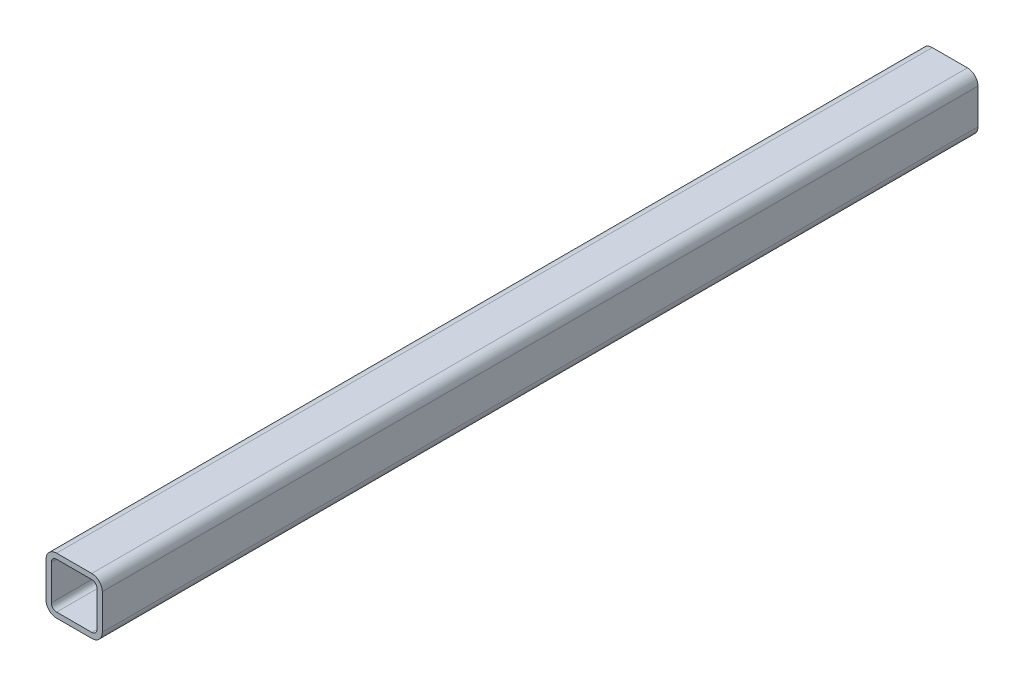
ISO-10303-21;
HEADER;
FILE_DESCRIPTION(('STEP AP214'),'2;1');
FILE_NAME('part.step','',(''),(''),'','','');
FILE_SCHEMA(('AUTOMOTIVE_DESIGN { 1 0 10303 214 1 1 1 1 }'));
ENDSEC;
DATA;
#1=APPLICATION_CONTEXT('core data for automotive mechanical design processes');
#2=APPLICATION_PROTOCOL_DEFINITION('international standard','automotive_design',2000,#1);
#3=PRODUCT_CONTEXT('',#1,'mechanical');
#4=PRODUCT('Part','Part','',(#3));
#5=PRODUCT_RELATED_PRODUCT_CATEGORY('part','',(#4));
#6=PRODUCT_DEFINITION_FORMATION('','',#4);
#7=PRODUCT_DEFINITION_CONTEXT('part definition',#1,'design');
#8=PRODUCT_DEFINITION('design','',#6,#7);
#9=PRODUCT_DEFINITION_SHAPE('','',#8);
#10=(LENGTH_UNIT() NAMED_UNIT(*) SI_UNIT(.MILLI.,.METRE.));
#11=(NAMED_UNIT(*) PLANE_ANGLE_UNIT() SI_UNIT($,.RADIAN.));
#12=(NAMED_UNIT(*) SI_UNIT($,.STERADIAN.) SOLID_ANGLE_UNIT());
#13=UNCERTAINTY_MEASURE_WITH_UNIT(LENGTH_MEASURE(1.E-05),#10,'distance_accuracy_value','');
#14=(GEOMETRIC_REPRESENTATION_CONTEXT(3) GLOBAL_UNCERTAINTY_ASSIGNED_CONTEXT((#13)) GLOBAL_UNIT_ASSIGNED_CONTEXT((#10,
#11,#12)) REPRESENTATION_CONTEXT('',''));
#15=CARTESIAN_POINT('',(0.,0.,0.));
#16=DIRECTION('',(0.,0.,1.));
#17=DIRECTION('',(1.,0.,0.));
#18=AXIS2_PLACEMENT_3D('',#15,#16,#17);
#19=CARTESIAN_POINT('',(41.27,41.27,790.2));
#20=DIRECTION('',(0.,0.,-1.));
#21=DIRECTION('',(-1.,0.,0.));
#22=AXIS2_PLACEMENT_3D('',#19,#20,#21);
#23=PLANE('',#22);
#24=CARTESIAN_POINT('',(41.27,41.27,790.2));
#25=DIRECTION('',(0.,0.,1.));
#26=DIRECTION('',(-1.,0.,0.));
#27=AXIS2_PLACEMENT_3D('',#24,#25,#26);
#28=CIRCLE('',#27,9.53);
#29=CARTESIAN_POINT('',(50.8,41.2699999999999,790.2));
#30=VERTEX_POINT('',#29);
#31=CARTESIAN_POINT('',(41.2699999999999,50.8,790.2));
#32=VERTEX_POINT('',#31);
#33=EDGE_CURVE('E246',#30,#32,#28,.T.);
#34=ORIENTED_EDGE('',*,*,#33,.T.);
#35=DIRECTION('',(-1.,0.,0.));
#36=VECTOR('',#35,1.);
#37=CARTESIAN_POINT('',(9.53000000000007,50.8,790.2));
#38=LINE('',#37,#36);
#39=CARTESIAN_POINT('',(9.53000000000007,50.8,790.2));
#40=VERTEX_POINT('',#39);
#41=EDGE_CURVE('E250',#32,#40,#38,.T.);
#42=ORIENTED_EDGE('',*,*,#41,.T.);
#43=CARTESIAN_POINT('',(9.53,41.27,790.2));
#44=DIRECTION('',(0.,0.,1.));
#45=DIRECTION('',(-1.,0.,0.));
#46=AXIS2_PLACEMENT_3D('',#43,#44,#45);
#47=CIRCLE('',#46,9.53);
#48=CARTESIAN_POINT('',(0.,41.2699999999999,790.2));
#49=VERTEX_POINT('',#48);
#50=EDGE_CURVE('E254',#40,#49,#47,.T.);
#51=ORIENTED_EDGE('',*,*,#50,.T.);
#52=DIRECTION('',(0.,-1.,0.));
#53=VECTOR('',#52,1.);
#54=CARTESIAN_POINT('',(0.,9.53000000000007,790.2));
#55=LINE('',#54,#53);
#56=CARTESIAN_POINT('',(0.,9.53000000000007,790.2));
#57=VERTEX_POINT('',#56);
#58=EDGE_CURVE('E257',#49,#57,#55,.T.);
#59=ORIENTED_EDGE('',*,*,#58,.T.);
#60=CARTESIAN_POINT('',(9.53,9.53,790.2));
#61=DIRECTION('',(0.,0.,1.));
#62=DIRECTION('',(-1.,0.,0.));
#63=AXIS2_PLACEMENT_3D('',#60,#61,#62);
#64=CIRCLE('',#63,9.53);
#65=CARTESIAN_POINT('',(9.53000000000007,0.,790.2));
#66=VERTEX_POINT('',#65);
#67=EDGE_CURVE('E260',#57,#66,#64,.T.);
#68=ORIENTED_EDGE('',*,*,#67,.T.);
#69=DIRECTION('',(1.,0.,0.));
#70=VECTOR('',#69,1.);
#71=CARTESIAN_POINT('',(9.53000000000007,0.,790.2));
#72=LINE('',#71,#70);
#73=CARTESIAN_POINT('',(41.2699999999999,0.,790.2));
#74=VERTEX_POINT('',#73);
#75=EDGE_CURVE('E263',#66,#74,#72,.T.);
#76=ORIENTED_EDGE('',*,*,#75,.T.);
#77=CARTESIAN_POINT('',(41.27,9.53,790.2));
#78=DIRECTION('',(0.,0.,1.));
#79=DIRECTION('',(-1.,0.,0.));
#80=AXIS2_PLACEMENT_3D('',#77,#78,#79);
#81=CIRCLE('',#80,9.53);
#82=CARTESIAN_POINT('',(50.8,9.53000000000007,790.2));
#83=VERTEX_POINT('',#82);
#84=EDGE_CURVE('E266',#74,#83,#81,.T.);
#85=ORIENTED_EDGE('',*,*,#84,.T.);
#86=DIRECTION('',(0.,1.,0.));
#87=VECTOR('',#86,1.);
#88=CARTESIAN_POINT('',(50.8,9.53000000000007,790.2));
#89=LINE('',#88,#87);
#90=EDGE_CURVE('E269',#83,#30,#89,.T.);
#91=ORIENTED_EDGE('',*,*,#90,.T.);
#92=EDGE_LOOP('',(#34,#42,#51,#59,#68,#76,#85,#91));
#93=FACE_BOUND('',#92,.T.);
#94=CARTESIAN_POINT('',(9.52,9.52,790.2));
#95=DIRECTION('',(0.,0.,1.));
#96=DIRECTION('',(1.,0.,0.));
#97=AXIS2_PLACEMENT_3D('',#94,#95,#96);
#98=CIRCLE('',#97,4.76);
#99=CARTESIAN_POINT('',(4.76,9.52000000000003,790.2));
#100=VERTEX_POINT('',#99);
#101=CARTESIAN_POINT('',(9.52000000000004,4.76,790.2));
#102=VERTEX_POINT('',#101);
#103=EDGE_CURVE('E157',#100,#102,#98,.T.);
#104=ORIENTED_EDGE('',*,*,#103,.F.);
#105=DIRECTION('',(0.,-1.,0.));
#106=VECTOR('',#105,1.);
#107=CARTESIAN_POINT('',(4.76,41.28,790.2));
#108=LINE('',#107,#106);
#109=CARTESIAN_POINT('',(4.76,41.28,790.2));
#110=VERTEX_POINT('',#109);
#111=EDGE_CURVE('E198',#110,#100,#108,.T.);
#112=ORIENTED_EDGE('',*,*,#111,.F.);
#113=CARTESIAN_POINT('',(9.52,41.28,790.2));
#114=DIRECTION('',(0.,0.,1.));
#115=DIRECTION('',(-1.,0.,0.));
#116=AXIS2_PLACEMENT_3D('',#113,#114,#115);
#117=CIRCLE('',#116,4.76);
#118=CARTESIAN_POINT('',(9.52000000000003,46.04,790.2));
#119=VERTEX_POINT('',#118);
#120=EDGE_CURVE('E195',#119,#110,#117,.T.);
#121=ORIENTED_EDGE('',*,*,#120,.F.);
#122=DIRECTION('',(-1.,0.,0.));
#123=VECTOR('',#122,1.);
#124=CARTESIAN_POINT('',(9.52000000000003,46.04,790.2));
#125=LINE('',#124,#123);
#126=CARTESIAN_POINT('',(41.28,46.04,790.2));
#127=VERTEX_POINT('',#126);
#128=EDGE_CURVE('E192',#127,#119,#125,.T.);
#129=ORIENTED_EDGE('',*,*,#128,.F.);
#130=CARTESIAN_POINT('',(41.28,41.28,790.2));
#131=DIRECTION('',(0.,0.,1.));
#132=DIRECTION('',(1.,0.,0.));
#133=AXIS2_PLACEMENT_3D('',#130,#131,#132);
#134=CIRCLE('',#133,4.76);
#135=CARTESIAN_POINT('',(46.04,41.28,790.2));
#136=VERTEX_POINT('',#135);
#137=EDGE_CURVE('E189',#136,#127,#134,.T.);
#138=ORIENTED_EDGE('',*,*,#137,.F.);
#139=DIRECTION('',(0.,1.,0.));
#140=VECTOR('',#139,1.);
#141=CARTESIAN_POINT('',(46.04,41.28,790.2));
#142=LINE('',#141,#140);
#143=CARTESIAN_POINT('',(46.04,9.52000000000003,790.2));
#144=VERTEX_POINT('',#143);
#145=EDGE_CURVE('E184',#144,#136,#142,.T.);
#146=ORIENTED_EDGE('',*,*,#145,.F.);
#147=CARTESIAN_POINT('',(41.28,9.52,790.2));
#148=DIRECTION('',(0.,0.,1.));
#149=DIRECTION('',(1.,0.,0.));
#150=AXIS2_PLACEMENT_3D('',#147,#148,#149);
#151=CIRCLE('',#150,4.76);
#152=CARTESIAN_POINT('',(41.28,4.76,790.2));
#153=VERTEX_POINT('',#152);
#154=EDGE_CURVE('E180',#153,#144,#151,.T.);
#155=ORIENTED_EDGE('',*,*,#154,.F.);
#156=DIRECTION('',(1.,0.,0.));
#157=VECTOR('',#156,1.);
#158=CARTESIAN_POINT('',(9.52000000000004,4.76,790.2));
#159=LINE('',#158,#157);
#160=EDGE_CURVE('E166',#102,#153,#159,.T.);
#161=ORIENTED_EDGE('',*,*,#160,.F.);
#162=EDGE_LOOP('',(#104,#112,#121,#129,#138,#146,#155,#161));
#163=FACE_BOUND('',#162,.T.);
#164=ADVANCED_FACE('F43',(#93,#163),#23,.F.);
#165=CARTESIAN_POINT('',(41.27,41.27,0.));
#166=DIRECTION('',(0.,0.,-1.));
#167=DIRECTION('',(-1.,0.,0.));
#168=AXIS2_PLACEMENT_3D('',#165,#166,#167);
#169=PLANE('',#168);
#170=CARTESIAN_POINT('',(41.27,41.27,0.));
#171=DIRECTION('',(0.,0.,1.));
#172=DIRECTION('',(-1.,0.,0.));
#173=AXIS2_PLACEMENT_3D('',#170,#171,#172);
#174=CIRCLE('',#173,9.53);
#175=CARTESIAN_POINT('',(50.8,41.2699999999999,0.));
#176=VERTEX_POINT('',#175);
#177=CARTESIAN_POINT('',(41.2699999999999,50.8,0.));
#178=VERTEX_POINT('',#177);
#179=EDGE_CURVE('E175',#176,#178,#174,.T.);
#180=ORIENTED_EDGE('',*,*,#179,.F.);
#181=DIRECTION('',(0.,1.,0.));
#182=VECTOR('',#181,1.);
#183=CARTESIAN_POINT('',(50.8,9.53000000000007,0.));
#184=LINE('',#183,#182);
#185=CARTESIAN_POINT('',(50.8,9.53000000000007,0.));
#186=VERTEX_POINT('',#185);
#187=EDGE_CURVE('E251',#186,#176,#184,.T.);
#188=ORIENTED_EDGE('',*,*,#187,.F.);
#189=CARTESIAN_POINT('',(41.27,9.53,0.));
#190=DIRECTION('',(0.,0.,1.));
#191=DIRECTION('',(-1.,0.,0.));
#192=AXIS2_PLACEMENT_3D('',#189,#190,#191);
#193=CIRCLE('',#192,9.53);
#194=CARTESIAN_POINT('',(41.2699999999999,0.,0.));
#195=VERTEX_POINT('',#194);
#196=EDGE_CURVE('E291',#195,#186,#193,.T.);
#197=ORIENTED_EDGE('',*,*,#196,.F.);
#198=DIRECTION('',(1.,0.,0.));
#199=VECTOR('',#198,1.);
#200=CARTESIAN_POINT('',(9.53000000000007,0.,0.));
#201=LINE('',#200,#199);
#202=CARTESIAN_POINT('',(9.53000000000007,0.,0.));
#203=VERTEX_POINT('',#202);
#204=EDGE_CURVE('E288',#203,#195,#201,.T.);
#205=ORIENTED_EDGE('',*,*,#204,.F.);
#206=CARTESIAN_POINT('',(9.53,9.53,0.));
#207=DIRECTION('',(0.,0.,1.));
#208=DIRECTION('',(-1.,0.,0.));
#209=AXIS2_PLACEMENT_3D('',#206,#207,#208);
#210=CIRCLE('',#209,9.53);
#211=CARTESIAN_POINT('',(0.,9.53000000000007,0.));
#212=VERTEX_POINT('',#211);
#213=EDGE_CURVE('E285',#212,#203,#210,.T.);
#214=ORIENTED_EDGE('',*,*,#213,.F.);
#215=DIRECTION('',(0.,-1.,0.));
#216=VECTOR('',#215,1.);
#217=CARTESIAN_POINT('',(0.,9.53000000000007,0.));
#218=LINE('',#217,#216);
#219=CARTESIAN_POINT('',(0.,41.2699999999999,0.));
#220=VERTEX_POINT('',#219);
#221=EDGE_CURVE('E282',#220,#212,#218,.T.);
#222=ORIENTED_EDGE('',*,*,#221,.F.);
#223=CARTESIAN_POINT('',(9.53,41.27,0.));
#224=DIRECTION('',(0.,0.,1.));
#225=DIRECTION('',(-1.,0.,0.));
#226=AXIS2_PLACEMENT_3D('',#223,#224,#225);
#227=CIRCLE('',#226,9.53);
#228=CARTESIAN_POINT('',(9.53000000000007,50.8,0.));
#229=VERTEX_POINT('',#228);
#230=EDGE_CURVE('E279',#229,#220,#227,.T.);
#231=ORIENTED_EDGE('',*,*,#230,.F.);
#232=DIRECTION('',(-1.,0.,0.));
#233=VECTOR('',#232,1.);
#234=CARTESIAN_POINT('',(9.53000000000007,50.8,0.));
#235=LINE('',#234,#233);
#236=EDGE_CURVE('E276',#178,#229,#235,.T.);
#237=ORIENTED_EDGE('',*,*,#236,.F.);
#238=EDGE_LOOP('',(#180,#188,#197,#205,#214,#222,#231,#237));
#239=FACE_BOUND('',#238,.T.);
#240=DIRECTION('',(0.,-1.,0.));
#241=VECTOR('',#240,1.);
#242=CARTESIAN_POINT('',(4.76,41.28,0.));
#243=LINE('',#242,#241);
#244=CARTESIAN_POINT('',(4.76,41.28,0.));
#245=VERTEX_POINT('',#244);
#246=CARTESIAN_POINT('',(4.76,9.52000000000004,0.));
#247=VERTEX_POINT('',#246);
#248=EDGE_CURVE('E167',#245,#247,#243,.T.);
#249=ORIENTED_EDGE('',*,*,#248,.T.);
#250=CARTESIAN_POINT('',(9.52,9.52,0.));
#251=DIRECTION('',(0.,0.,1.));
#252=DIRECTION('',(1.,0.,0.));
#253=AXIS2_PLACEMENT_3D('',#250,#251,#252);
#254=CIRCLE('',#253,4.76);
#255=CARTESIAN_POINT('',(9.52000000000004,4.76,0.));
#256=VERTEX_POINT('',#255);
#257=EDGE_CURVE('E67',#247,#256,#254,.T.);
#258=ORIENTED_EDGE('',*,*,#257,.T.);
#259=DIRECTION('',(1.,0.,0.));
#260=VECTOR('',#259,1.);
#261=CARTESIAN_POINT('',(9.52000000000004,4.76,0.));
#262=LINE('',#261,#260);
#263=CARTESIAN_POINT('',(41.28,4.76,0.));
#264=VERTEX_POINT('',#263);
#265=EDGE_CURVE('E173',#256,#264,#262,.T.);
#266=ORIENTED_EDGE('',*,*,#265,.T.);
#267=CARTESIAN_POINT('',(41.28,9.52,0.));
#268=DIRECTION('',(0.,0.,1.));
#269=DIRECTION('',(1.,0.,0.));
#270=AXIS2_PLACEMENT_3D('',#267,#268,#269);
#271=CIRCLE('',#270,4.76);
#272=CARTESIAN_POINT('',(46.04,9.52000000000003,0.));
#273=VERTEX_POINT('',#272);
#274=EDGE_CURVE('E205',#264,#273,#271,.T.);
#275=ORIENTED_EDGE('',*,*,#274,.T.);
#276=DIRECTION('',(0.,1.,0.));
#277=VECTOR('',#276,1.);
#278=CARTESIAN_POINT('',(46.04,41.28,0.));
#279=LINE('',#278,#277);
#280=CARTESIAN_POINT('',(46.04,41.28,0.));
#281=VERTEX_POINT('',#280);
#282=EDGE_CURVE('E209',#273,#281,#279,.T.);
#283=ORIENTED_EDGE('',*,*,#282,.T.);
#284=CARTESIAN_POINT('',(41.28,41.28,0.));
#285=DIRECTION('',(0.,0.,1.));
#286=DIRECTION('',(1.,0.,0.));
#287=AXIS2_PLACEMENT_3D('',#284,#285,#286);
#288=CIRCLE('',#287,4.76);
#289=CARTESIAN_POINT('',(41.28,46.04,0.));
#290=VERTEX_POINT('',#289);
#291=EDGE_CURVE('E213',#281,#290,#288,.T.);
#292=ORIENTED_EDGE('',*,*,#291,.T.);
#293=DIRECTION('',(-1.,0.,0.));
#294=VECTOR('',#293,1.);
#295=CARTESIAN_POINT('',(9.52000000000003,46.04,0.));
#296=LINE('',#295,#294);
#297=CARTESIAN_POINT('',(9.52000000000003,46.04,0.));
#298=VERTEX_POINT('',#297);
#299=EDGE_CURVE('E217',#290,#298,#296,.T.);
#300=ORIENTED_EDGE('',*,*,#299,.T.);
#301=CARTESIAN_POINT('',(9.52,41.28,0.));
#302=DIRECTION('',(0.,0.,1.));
#303=DIRECTION('',(-1.,0.,0.));
#304=AXIS2_PLACEMENT_3D('',#301,#302,#303);
#305=CIRCLE('',#304,4.76);
#306=EDGE_CURVE('E221',#298,#245,#305,.T.);
#307=ORIENTED_EDGE('',*,*,#306,.T.);
#308=EDGE_LOOP('',(#249,#258,#266,#275,#283,#292,#300,#307));
#309=FACE_BOUND('',#308,.T.);
#310=ADVANCED_FACE('F330',(#239,#309),#169,.T.);
#311=CARTESIAN_POINT('',(41.27,41.27,790.2));
#312=DIRECTION('',(0.,0.,-1.));
#313=DIRECTION('',(-1.,0.,0.));
#314=AXIS2_PLACEMENT_3D('',#311,#312,#313);
#315=CYLINDRICAL_SURFACE('',#314,9.53);
#316=ORIENTED_EDGE('',*,*,#179,.T.);
#317=DIRECTION('',(0.,0.,-1.));
#318=VECTOR('',#317,1.);
#319=CARTESIAN_POINT('',(41.2699999999999,50.8,790.2));
#320=LINE('',#319,#318);
#321=EDGE_CURVE('E11',#32,#178,#320,.T.);
#322=ORIENTED_EDGE('',*,*,#321,.F.);
#323=ORIENTED_EDGE('',*,*,#33,.F.);
#324=DIRECTION('',(0.,0.,-1.));
#325=VECTOR('',#324,1.);
#326=CARTESIAN_POINT('',(50.8,41.2699999999999,790.2));
#327=LINE('',#326,#325);
#328=EDGE_CURVE('E272',#30,#176,#327,.T.);
#329=ORIENTED_EDGE('',*,*,#328,.T.);
#330=EDGE_LOOP('',(#316,#322,#323,#329));
#331=FACE_BOUND('',#330,.T.);
#332=ADVANCED_FACE('F45',(#331),#315,.T.);
#333=CARTESIAN_POINT('',(9.53000000000007,50.8,790.2));
#334=DIRECTION('',(0.,-1.,0.));
#335=DIRECTION('',(0.,0.,-1.));
#336=AXIS2_PLACEMENT_3D('',#333,#334,#335);
#337=PLANE('',#336);
#338=ORIENTED_EDGE('',*,*,#236,.T.);
#339=DIRECTION('',(0.,0.,-1.));
#340=VECTOR('',#339,1.);
#341=CARTESIAN_POINT('',(9.53000000000007,50.8,790.2));
#342=LINE('',#341,#340);
#343=EDGE_CURVE('E52',#40,#229,#342,.T.);
#344=ORIENTED_EDGE('',*,*,#343,.F.);
#345=ORIENTED_EDGE('',*,*,#41,.F.);
#346=ORIENTED_EDGE('',*,*,#321,.T.);
#347=EDGE_LOOP('',(#338,#344,#345,#346));
#348=FACE_BOUND('',#347,.T.);
#349=ADVANCED_FACE('F347',(#348),#337,.F.);
#350=CARTESIAN_POINT('',(9.53,41.27,790.2));
#351=DIRECTION('',(0.,0.,-1.));
#352=DIRECTION('',(-1.,0.,0.));
#353=AXIS2_PLACEMENT_3D('',#350,#351,#352);
#354=CYLINDRICAL_SURFACE('',#353,9.53);
#355=ORIENTED_EDGE('',*,*,#230,.T.);
#356=DIRECTION('',(0.,0.,-1.));
#357=VECTOR('',#356,1.);
#358=CARTESIAN_POINT('',(0.,41.2699999999999,790.2));
#359=LINE('',#358,#357);
#360=EDGE_CURVE('E315',#49,#220,#359,.T.);
#361=ORIENTED_EDGE('',*,*,#360,.F.);
#362=ORIENTED_EDGE('',*,*,#50,.F.);
#363=ORIENTED_EDGE('',*,*,#343,.T.);
#364=EDGE_LOOP('',(#355,#361,#362,#363));
#365=FACE_BOUND('',#364,.T.);
#366=ADVANCED_FACE('F324',(#365),#354,.T.);
#367=CARTESIAN_POINT('',(0.,9.53000000000007,790.2));
#368=DIRECTION('',(1.,0.,0.));
#369=DIRECTION('',(0.,0.,-1.));
#370=AXIS2_PLACEMENT_3D('',#367,#368,#369);
#371=PLANE('',#370);
#372=ORIENTED_EDGE('',*,*,#221,.T.);
#373=DIRECTION('',(0.,0.,-1.));
#374=VECTOR('',#373,1.);
#375=CARTESIAN_POINT('',(0.,9.53000000000007,790.2));
#376=LINE('',#375,#374);
#377=EDGE_CURVE('E311',#57,#212,#376,.T.);
#378=ORIENTED_EDGE('',*,*,#377,.F.);
#379=ORIENTED_EDGE('',*,*,#58,.F.);
#380=ORIENTED_EDGE('',*,*,#360,.T.);
#381=EDGE_LOOP('',(#372,#378,#379,#380));
#382=FACE_BOUND('',#381,.T.);
#383=ADVANCED_FACE('F336',(#382),#371,.F.);
#384=CARTESIAN_POINT('',(9.53,9.53,790.2));
#385=DIRECTION('',(0.,0.,-1.));
#386=DIRECTION('',(-1.,0.,0.));
#387=AXIS2_PLACEMENT_3D('',#384,#385,#386);
#388=CYLINDRICAL_SURFACE('',#387,9.53);
#389=ORIENTED_EDGE('',*,*,#213,.T.);
#390=DIRECTION('',(0.,0.,-1.));
#391=VECTOR('',#390,1.);
#392=CARTESIAN_POINT('',(9.53000000000007,0.,790.2));
#393=LINE('',#392,#391);
#394=EDGE_CURVE('E307',#66,#203,#393,.T.);
#395=ORIENTED_EDGE('',*,*,#394,.F.);
#396=ORIENTED_EDGE('',*,*,#67,.F.);
#397=ORIENTED_EDGE('',*,*,#377,.T.);
#398=EDGE_LOOP('',(#389,#395,#396,#397));
#399=FACE_BOUND('',#398,.T.);
#400=ADVANCED_FACE('F340',(#399),#388,.T.);
#401=CARTESIAN_POINT('',(9.53000000000007,0.,790.2));
#402=DIRECTION('',(0.,1.,0.));
#403=DIRECTION('',(0.,0.,1.));
#404=AXIS2_PLACEMENT_3D('',#401,#402,#403);
#405=PLANE('',#404);
#406=ORIENTED_EDGE('',*,*,#204,.T.);
#407=DIRECTION('',(0.,0.,-1.));
#408=VECTOR('',#407,1.);
#409=CARTESIAN_POINT('',(41.2699999999999,0.,790.2));
#410=LINE('',#409,#408);
#411=EDGE_CURVE('E303',#74,#195,#410,.T.);
#412=ORIENTED_EDGE('',*,*,#411,.F.);
#413=ORIENTED_EDGE('',*,*,#75,.F.);
#414=ORIENTED_EDGE('',*,*,#394,.T.);
#415=EDGE_LOOP('',(#406,#412,#413,#414));
#416=FACE_BOUND('',#415,.T.);
#417=ADVANCED_FACE('F360',(#416),#405,.F.);
#418=CARTESIAN_POINT('',(41.27,9.53,790.2));
#419=DIRECTION('',(0.,0.,-1.));
#420=DIRECTION('',(-1.,0.,0.));
#421=AXIS2_PLACEMENT_3D('',#418,#419,#420);
#422=CYLINDRICAL_SURFACE('',#421,9.53);
#423=ORIENTED_EDGE('',*,*,#196,.T.);
#424=DIRECTION('',(0.,0.,-1.));
#425=VECTOR('',#424,1.);
#426=CARTESIAN_POINT('',(50.8,9.53000000000007,790.2));
#427=LINE('',#426,#425);
#428=EDGE_CURVE('E299',#83,#186,#427,.T.);
#429=ORIENTED_EDGE('',*,*,#428,.F.);
#430=ORIENTED_EDGE('',*,*,#84,.F.);
#431=ORIENTED_EDGE('',*,*,#411,.T.);
#432=EDGE_LOOP('',(#423,#429,#430,#431));
#433=FACE_BOUND('',#432,.T.);
#434=ADVANCED_FACE('F358',(#433),#422,.T.);
#435=CARTESIAN_POINT('',(50.8,9.53000000000007,790.2));
#436=DIRECTION('',(-1.,0.,0.));
#437=DIRECTION('',(0.,0.,1.));
#438=AXIS2_PLACEMENT_3D('',#435,#436,#437);
#439=PLANE('',#438);
#440=ORIENTED_EDGE('',*,*,#187,.T.);
#441=ORIENTED_EDGE('',*,*,#328,.F.);
#442=ORIENTED_EDGE('',*,*,#90,.F.);
#443=ORIENTED_EDGE('',*,*,#428,.T.);
#444=EDGE_LOOP('',(#440,#441,#442,#443));
#445=FACE_BOUND('',#444,.T.);
#446=ADVANCED_FACE('F353',(#445),#439,.F.);
#447=CARTESIAN_POINT('',(9.52,9.52,790.2));
#448=DIRECTION('',(0.,0.,-1.));
#449=DIRECTION('',(-1.,0.,0.));
#450=AXIS2_PLACEMENT_3D('',#447,#448,#449);
#451=CYLINDRICAL_SURFACE('',#450,4.76);
#452=ORIENTED_EDGE('',*,*,#257,.F.);
#453=DIRECTION('',(0.,0.,-1.));
#454=VECTOR('',#453,1.);
#455=CARTESIAN_POINT('',(4.76,9.52000000000003,790.2));
#456=LINE('',#455,#454);
#457=EDGE_CURVE('E161',#100,#247,#456,.T.);
#458=ORIENTED_EDGE('',*,*,#457,.F.);
#459=ORIENTED_EDGE('',*,*,#103,.T.);
#460=DIRECTION('',(0.,0.,-1.));
#461=VECTOR('',#460,1.);
#462=CARTESIAN_POINT('',(9.52000000000004,4.76,790.2));
#463=LINE('',#462,#461);
#464=EDGE_CURVE('E160',#102,#256,#463,.T.);
#465=ORIENTED_EDGE('',*,*,#464,.T.);
#466=EDGE_LOOP('',(#452,#458,#459,#465));
#467=FACE_BOUND('',#466,.T.);
#468=ADVANCED_FACE('F159',(#467),#451,.F.);
#469=CARTESIAN_POINT('',(9.52000000000004,4.76,790.2));
#470=DIRECTION('',(0.,1.,0.));
#471=DIRECTION('',(-1.,0.,0.));
#472=AXIS2_PLACEMENT_3D('',#469,#470,#471);
#473=PLANE('',#472);
#474=ORIENTED_EDGE('',*,*,#265,.F.);
#475=ORIENTED_EDGE('',*,*,#464,.F.);
#476=ORIENTED_EDGE('',*,*,#160,.T.);
#477=DIRECTION('',(0.,0.,-1.));
#478=VECTOR('',#477,1.);
#479=CARTESIAN_POINT('',(41.28,4.76,790.2));
#480=LINE('',#479,#478);
#481=EDGE_CURVE('E176',#153,#264,#480,.T.);
#482=ORIENTED_EDGE('',*,*,#481,.T.);
#483=EDGE_LOOP('',(#474,#475,#476,#482));
#484=FACE_BOUND('',#483,.T.);
#485=ADVANCED_FACE('F170',(#484),#473,.T.);
#486=CARTESIAN_POINT('',(41.28,9.52,790.2));
#487=DIRECTION('',(0.,0.,-1.));
#488=DIRECTION('',(-1.,0.,0.));
#489=AXIS2_PLACEMENT_3D('',#486,#487,#488);
#490=CYLINDRICAL_SURFACE('',#489,4.76);
#491=ORIENTED_EDGE('',*,*,#274,.F.);
#492=ORIENTED_EDGE('',*,*,#481,.F.);
#493=ORIENTED_EDGE('',*,*,#154,.T.);
#494=DIRECTION('',(0.,0.,-1.));
#495=VECTOR('',#494,1.);
#496=CARTESIAN_POINT('',(46.04,9.52000000000003,790.2));
#497=LINE('',#496,#495);
#498=EDGE_CURVE('E241',#144,#273,#497,.T.);
#499=ORIENTED_EDGE('',*,*,#498,.T.);
#500=EDGE_LOOP('',(#491,#492,#493,#499));
#501=FACE_BOUND('',#500,.T.);
#502=ADVANCED_FACE('F385',(#501),#490,.F.);
#503=CARTESIAN_POINT('',(46.04,41.28,790.2));
#504=DIRECTION('',(-1.,0.,0.));
#505=DIRECTION('',(0.,-1.,0.));
#506=AXIS2_PLACEMENT_3D('',#503,#504,#505);
#507=PLANE('',#506);
#508=ORIENTED_EDGE('',*,*,#282,.F.);
#509=ORIENTED_EDGE('',*,*,#498,.F.);
#510=ORIENTED_EDGE('',*,*,#145,.T.);
#511=DIRECTION('',(0.,0.,-1.));
#512=VECTOR('',#511,1.);
#513=CARTESIAN_POINT('',(46.04,41.28,790.2));
#514=LINE('',#513,#512);
#515=EDGE_CURVE('E238',#136,#281,#514,.T.);
#516=ORIENTED_EDGE('',*,*,#515,.T.);
#517=EDGE_LOOP('',(#508,#509,#510,#516));
#518=FACE_BOUND('',#517,.T.);
#519=ADVANCED_FACE('F389',(#518),#507,.T.);
#520=CARTESIAN_POINT('',(41.28,41.28,790.2));
#521=DIRECTION('',(0.,0.,-1.));
#522=DIRECTION('',(-1.,0.,0.));
#523=AXIS2_PLACEMENT_3D('',#520,#521,#522);
#524=CYLINDRICAL_SURFACE('',#523,4.76);
#525=ORIENTED_EDGE('',*,*,#291,.F.);
#526=ORIENTED_EDGE('',*,*,#515,.F.);
#527=ORIENTED_EDGE('',*,*,#137,.T.);
#528=DIRECTION('',(0.,0.,-1.));
#529=VECTOR('',#528,1.);
#530=CARTESIAN_POINT('',(41.28,46.04,790.2));
#531=LINE('',#530,#529);
#532=EDGE_CURVE('E235',#127,#290,#531,.T.);
#533=ORIENTED_EDGE('',*,*,#532,.T.);
#534=EDGE_LOOP('',(#525,#526,#527,#533));
#535=FACE_BOUND('',#534,.T.);
#536=ADVANCED_FACE('F395',(#535),#524,.F.);
#537=CARTESIAN_POINT('',(9.52000000000003,46.04,790.2));
#538=DIRECTION('',(0.,-1.,0.));
#539=DIRECTION('',(0.,0.,-1.));
#540=AXIS2_PLACEMENT_3D('',#537,#538,#539);
#541=PLANE('',#540);
#542=ORIENTED_EDGE('',*,*,#299,.F.);
#543=ORIENTED_EDGE('',*,*,#532,.F.);
#544=ORIENTED_EDGE('',*,*,#128,.T.);
#545=DIRECTION('',(0.,0.,-1.));
#546=VECTOR('',#545,1.);
#547=CARTESIAN_POINT('',(9.52000000000003,46.04,790.2));
#548=LINE('',#547,#546);
#549=EDGE_CURVE('E232',#119,#298,#548,.T.);
#550=ORIENTED_EDGE('',*,*,#549,.T.);
#551=EDGE_LOOP('',(#542,#543,#544,#550));
#552=FACE_BOUND('',#551,.T.);
#553=ADVANCED_FACE('F399',(#552),#541,.T.);
#554=CARTESIAN_POINT('',(9.52,41.28,790.2));
#555=DIRECTION('',(0.,0.,-1.));
#556=DIRECTION('',(-1.,0.,0.));
#557=AXIS2_PLACEMENT_3D('',#554,#555,#556);
#558=CYLINDRICAL_SURFACE('',#557,4.76);
#559=ORIENTED_EDGE('',*,*,#306,.F.);
#560=ORIENTED_EDGE('',*,*,#549,.F.);
#561=ORIENTED_EDGE('',*,*,#120,.T.);
#562=DIRECTION('',(0.,0.,-1.));
#563=VECTOR('',#562,1.);
#564=CARTESIAN_POINT('',(4.76,41.28,790.2));
#565=LINE('',#564,#563);
#566=EDGE_CURVE('E59',#110,#245,#565,.T.);
#567=ORIENTED_EDGE('',*,*,#566,.T.);
#568=EDGE_LOOP('',(#559,#560,#561,#567));
#569=FACE_BOUND('',#568,.T.);
#570=ADVANCED_FACE('F403',(#569),#558,.F.);
#571=CARTESIAN_POINT('',(4.76,41.28,790.2));
#572=DIRECTION('',(1.,0.,0.));
#573=DIRECTION('',(0.,1.,0.));
#574=AXIS2_PLACEMENT_3D('',#571,#572,#573);
#575=PLANE('',#574);
#576=ORIENTED_EDGE('',*,*,#248,.F.);
#577=ORIENTED_EDGE('',*,*,#566,.F.);
#578=ORIENTED_EDGE('',*,*,#111,.T.);
#579=ORIENTED_EDGE('',*,*,#457,.T.);
#580=EDGE_LOOP('',(#576,#577,#578,#579));
#581=FACE_BOUND('',#580,.T.);
#582=ADVANCED_FACE('F407',(#581),#575,.T.);
#583=CLOSED_SHELL('',(#164,#310,#332,#349,#366,#383,#400,#417,#434,#446,#468,#485,#502,#519,
#536,#553,#570,#582));
#584=MANIFOLD_SOLID_BREP('B2',#583);
#585=ADVANCED_BREP_SHAPE_REPRESENTATION('',(#18,#584),#14);
#586=SHAPE_DEFINITION_REPRESENTATION(#9,#585);
ENDSEC;
END-ISO-10303-21;
